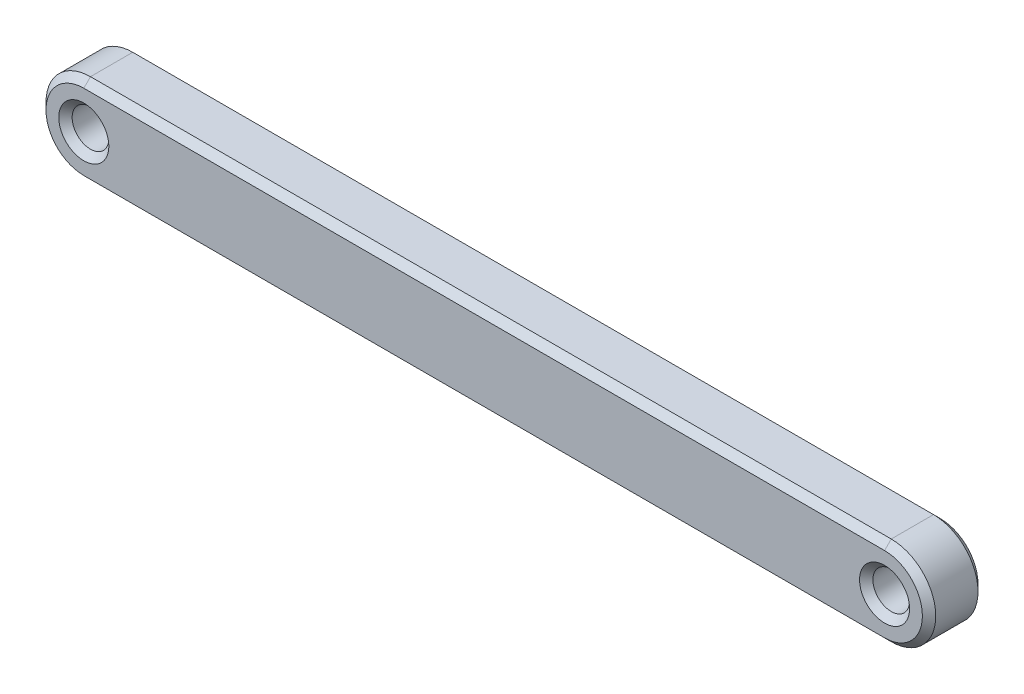
ISO-10303-21;
HEADER;
FILE_DESCRIPTION(('STEP AP214'),'2;1');
FILE_NAME('part.step','',(''),(''),'','','');
FILE_SCHEMA(('AUTOMOTIVE_DESIGN { 1 0 10303 214 1 1 1 1 }'));
ENDSEC;
DATA;
#1=APPLICATION_CONTEXT('core data for automotive mechanical design processes');
#2=APPLICATION_PROTOCOL_DEFINITION('international standard','automotive_design',2000,#1);
#3=PRODUCT_CONTEXT('',#1,'mechanical');
#4=PRODUCT('Part','Part','',(#3));
#5=PRODUCT_RELATED_PRODUCT_CATEGORY('part','',(#4));
#6=PRODUCT_DEFINITION_FORMATION('','',#4);
#7=PRODUCT_DEFINITION_CONTEXT('part definition',#1,'design');
#8=PRODUCT_DEFINITION('design','',#6,#7);
#9=PRODUCT_DEFINITION_SHAPE('','',#8);
#10=(LENGTH_UNIT() NAMED_UNIT(*) SI_UNIT(.MILLI.,.METRE.));
#11=(NAMED_UNIT(*) PLANE_ANGLE_UNIT() SI_UNIT($,.RADIAN.));
#12=(NAMED_UNIT(*) SI_UNIT($,.STERADIAN.) SOLID_ANGLE_UNIT());
#13=UNCERTAINTY_MEASURE_WITH_UNIT(LENGTH_MEASURE(1.E-05),#10,'distance_accuracy_value','');
#14=(GEOMETRIC_REPRESENTATION_CONTEXT(3) GLOBAL_UNCERTAINTY_ASSIGNED_CONTEXT((#13)) GLOBAL_UNIT_ASSIGNED_CONTEXT((#10,
#11,#12)) REPRESENTATION_CONTEXT('',''));
#15=CARTESIAN_POINT('',(0.,0.,0.));
#16=DIRECTION('',(0.,0.,1.));
#17=DIRECTION('',(1.,0.,0.));
#18=AXIS2_PLACEMENT_3D('',#15,#16,#17);
#19=CARTESIAN_POINT('',(-36.,0.,5.));
#20=DIRECTION('',(0.,0.,1.));
#21=DIRECTION('',(1.,0.,0.));
#22=AXIS2_PLACEMENT_3D('',#19,#20,#21);
#23=PLANE('',#22);
#24=CARTESIAN_POINT('',(36.,0.,5.));
#25=DIRECTION('',(0.,0.,1.));
#26=DIRECTION('',(1.,0.,0.));
#27=AXIS2_PLACEMENT_3D('',#24,#25,#26);
#28=CIRCLE('',#27,2.25);
#29=CARTESIAN_POINT('',(38.25,0.,5.));
#30=VERTEX_POINT('',#29);
#31=EDGE_CURVE('E171',#30,#30,#28,.F.);
#32=ORIENTED_EDGE('',*,*,#31,.T.);
#33=EDGE_LOOP('',(#32));
#34=FACE_BOUND('',#33,.T.);
#35=CARTESIAN_POINT('',(-36.,0.,5.));
#36=DIRECTION('',(0.,0.,1.));
#37=DIRECTION('',(1.,0.,0.));
#38=AXIS2_PLACEMENT_3D('',#35,#36,#37);
#39=CIRCLE('',#38,2.25);
#40=CARTESIAN_POINT('',(-33.75,0.,5.));
#41=VERTEX_POINT('',#40);
#42=EDGE_CURVE('E174',#41,#41,#39,.F.);
#43=ORIENTED_EDGE('',*,*,#42,.T.);
#44=EDGE_LOOP('',(#43));
#45=FACE_BOUND('',#44,.T.);
#46=CARTESIAN_POINT('',(-36.,0.,5.));
#47=DIRECTION('',(0.,0.,1.));
#48=DIRECTION('',(1.,0.,0.));
#49=AXIS2_PLACEMENT_3D('',#46,#47,#48);
#50=CIRCLE('',#49,3.40000000000002);
#51=CARTESIAN_POINT('',(-36.,3.40000000000002,5.));
#52=VERTEX_POINT('',#51);
#53=CARTESIAN_POINT('',(-36.,-3.40000000000002,5.));
#54=VERTEX_POINT('',#53);
#55=EDGE_CURVE('E182',#52,#54,#50,.T.);
#56=ORIENTED_EDGE('',*,*,#55,.T.);
#57=DIRECTION('',(1.,0.,0.));
#58=VECTOR('',#57,1.);
#59=CARTESIAN_POINT('',(36.,-3.4,5.));
#60=LINE('',#59,#58);
#61=CARTESIAN_POINT('',(36.,-3.4,5.));
#62=VERTEX_POINT('',#61);
#63=EDGE_CURVE('E177',#54,#62,#60,.T.);
#64=ORIENTED_EDGE('',*,*,#63,.T.);
#65=CARTESIAN_POINT('',(36.,0.,5.));
#66=DIRECTION('',(0.,0.,1.));
#67=DIRECTION('',(1.,0.,0.));
#68=AXIS2_PLACEMENT_3D('',#65,#66,#67);
#69=CIRCLE('',#68,3.40000000000002);
#70=CARTESIAN_POINT('',(36.,3.40000000000003,5.));
#71=VERTEX_POINT('',#70);
#72=EDGE_CURVE('E180',#62,#71,#69,.T.);
#73=ORIENTED_EDGE('',*,*,#72,.T.);
#74=DIRECTION('',(-1.,0.,0.));
#75=VECTOR('',#74,1.);
#76=CARTESIAN_POINT('',(-36.,3.40000000000002,5.));
#77=LINE('',#76,#75);
#78=EDGE_CURVE('E184',#71,#52,#77,.T.);
#79=ORIENTED_EDGE('',*,*,#78,.T.);
#80=EDGE_LOOP('',(#56,#64,#73,#79));
#81=FACE_BOUND('',#80,.T.);
#82=ADVANCED_FACE('F38',(#34,#45,#81),#23,.T.);
#83=CARTESIAN_POINT('',(-36.,0.,0.));
#84=DIRECTION('',(0.,0.,1.));
#85=DIRECTION('',(1.,0.,0.));
#86=AXIS2_PLACEMENT_3D('',#83,#84,#85);
#87=PLANE('',#86);
#88=CARTESIAN_POINT('',(36.,0.,0.));
#89=DIRECTION('',(0.,0.,1.));
#90=DIRECTION('',(1.,0.,0.));
#91=AXIS2_PLACEMENT_3D('',#88,#89,#90);
#92=CIRCLE('',#91,2.25);
#93=CARTESIAN_POINT('',(38.25,0.,0.));
#94=VERTEX_POINT('',#93);
#95=EDGE_CURVE('E198',#94,#94,#92,.T.);
#96=ORIENTED_EDGE('',*,*,#95,.T.);
#97=EDGE_LOOP('',(#96));
#98=FACE_BOUND('',#97,.T.);
#99=CARTESIAN_POINT('',(-36.,0.,0.));
#100=DIRECTION('',(0.,0.,1.));
#101=DIRECTION('',(1.,0.,0.));
#102=AXIS2_PLACEMENT_3D('',#99,#100,#101);
#103=CIRCLE('',#102,2.25000000000002);
#104=CARTESIAN_POINT('',(-33.75,0.,0.));
#105=VERTEX_POINT('',#104);
#106=EDGE_CURVE('E201',#105,#105,#103,.T.);
#107=ORIENTED_EDGE('',*,*,#106,.T.);
#108=EDGE_LOOP('',(#107));
#109=FACE_BOUND('',#108,.T.);
#110=CARTESIAN_POINT('',(36.,0.,0.));
#111=DIRECTION('',(0.,0.,1.));
#112=DIRECTION('',(1.,0.,0.));
#113=AXIS2_PLACEMENT_3D('',#110,#111,#112);
#114=CIRCLE('',#113,3.40000000000002);
#115=CARTESIAN_POINT('',(36.,3.40000000000003,0.));
#116=VERTEX_POINT('',#115);
#117=CARTESIAN_POINT('',(36.,-3.4,0.));
#118=VERTEX_POINT('',#117);
#119=EDGE_CURVE('E116',#116,#118,#114,.F.);
#120=ORIENTED_EDGE('',*,*,#119,.T.);
#121=DIRECTION('',(-1.,0.,0.));
#122=VECTOR('',#121,1.);
#123=CARTESIAN_POINT('',(-36.,-3.40000000000002,0.));
#124=LINE('',#123,#122);
#125=CARTESIAN_POINT('',(-36.,-3.40000000000002,0.));
#126=VERTEX_POINT('',#125);
#127=EDGE_CURVE('E112',#118,#126,#124,.T.);
#128=ORIENTED_EDGE('',*,*,#127,.T.);
#129=CARTESIAN_POINT('',(-36.,0.,0.));
#130=DIRECTION('',(0.,0.,1.));
#131=DIRECTION('',(1.,0.,0.));
#132=AXIS2_PLACEMENT_3D('',#129,#130,#131);
#133=CIRCLE('',#132,3.40000000000002);
#134=CARTESIAN_POINT('',(-36.,3.40000000000002,0.));
#135=VERTEX_POINT('',#134);
#136=EDGE_CURVE('E106',#126,#135,#133,.F.);
#137=ORIENTED_EDGE('',*,*,#136,.T.);
#138=DIRECTION('',(1.,0.,0.));
#139=VECTOR('',#138,1.);
#140=CARTESIAN_POINT('',(-36.,3.40000000000002,0.));
#141=LINE('',#140,#139);
#142=EDGE_CURVE('E109',#135,#116,#141,.T.);
#143=ORIENTED_EDGE('',*,*,#142,.T.);
#144=EDGE_LOOP('',(#120,#128,#137,#143));
#145=FACE_BOUND('',#144,.T.);
#146=ADVANCED_FACE('F108',(#98,#109,#145),#87,.F.);
#147=CARTESIAN_POINT('',(-36.,0.,5.));
#148=DIRECTION('',(0.,0.,-1.));
#149=DIRECTION('',(-1.,0.,0.));
#150=AXIS2_PLACEMENT_3D('',#147,#148,#149);
#151=CYLINDRICAL_SURFACE('',#150,4.00000000000001);
#152=DIRECTION('',(0.,0.,-1.));
#153=VECTOR('',#152,1.);
#154=CARTESIAN_POINT('',(-36.,4.00000000000001,5.));
#155=LINE('',#154,#153);
#156=CARTESIAN_POINT('',(-36.,4.00000000000001,4.4));
#157=VERTEX_POINT('',#156);
#158=CARTESIAN_POINT('',(-36.,4.00000000000001,0.599999999999996));
#159=VERTEX_POINT('',#158);
#160=EDGE_CURVE('E130',#157,#159,#155,.T.);
#161=ORIENTED_EDGE('',*,*,#160,.T.);
#162=CARTESIAN_POINT('',(-36.,0.,0.599999999999996));
#163=DIRECTION('',(0.,0.,1.));
#164=DIRECTION('',(1.,0.,0.));
#165=AXIS2_PLACEMENT_3D('',#162,#163,#164);
#166=CIRCLE('',#165,4.00000000000001);
#167=CARTESIAN_POINT('',(-36.,-4.00000000000001,0.599999999999996));
#168=VERTEX_POINT('',#167);
#169=EDGE_CURVE('E129',#159,#168,#166,.T.);
#170=ORIENTED_EDGE('',*,*,#169,.T.);
#171=DIRECTION('',(0.,0.,-1.));
#172=VECTOR('',#171,1.);
#173=CARTESIAN_POINT('',(-36.,-4.00000000000001,5.));
#174=LINE('',#173,#172);
#175=CARTESIAN_POINT('',(-36.,-4.00000000000001,4.4));
#176=VERTEX_POINT('',#175);
#177=EDGE_CURVE('E126',#176,#168,#174,.T.);
#178=ORIENTED_EDGE('',*,*,#177,.F.);
#179=CARTESIAN_POINT('',(-36.,0.,4.4));
#180=DIRECTION('',(0.,0.,1.));
#181=DIRECTION('',(1.,0.,0.));
#182=AXIS2_PLACEMENT_3D('',#179,#180,#181);
#183=CIRCLE('',#182,4.00000000000001);
#184=EDGE_CURVE('E61',#176,#157,#183,.F.);
#185=ORIENTED_EDGE('',*,*,#184,.T.);
#186=EDGE_LOOP('',(#161,#170,#178,#185));
#187=FACE_BOUND('',#186,.T.);
#188=ADVANCED_FACE('F229',(#187),#151,.T.);
#189=CARTESIAN_POINT('',(-36.,-4.00000000000001,5.));
#190=DIRECTION('',(0.,1.,0.));
#191=DIRECTION('',(-1.,0.,0.));
#192=AXIS2_PLACEMENT_3D('',#189,#190,#191);
#193=PLANE('',#192);
#194=ORIENTED_EDGE('',*,*,#177,.T.);
#195=DIRECTION('',(1.,0.,0.));
#196=VECTOR('',#195,1.);
#197=CARTESIAN_POINT('',(-36.,-4.00000000000001,0.599999999999996));
#198=LINE('',#197,#196);
#199=CARTESIAN_POINT('',(36.,-4.,0.599999999999996));
#200=VERTEX_POINT('',#199);
#201=EDGE_CURVE('E165',#168,#200,#198,.T.);
#202=ORIENTED_EDGE('',*,*,#201,.T.);
#203=DIRECTION('',(0.,0.,-1.));
#204=VECTOR('',#203,1.);
#205=CARTESIAN_POINT('',(36.,-4.,5.));
#206=LINE('',#205,#204);
#207=CARTESIAN_POINT('',(36.,-4.,4.4));
#208=VERTEX_POINT('',#207);
#209=EDGE_CURVE('E208',#208,#200,#206,.T.);
#210=ORIENTED_EDGE('',*,*,#209,.F.);
#211=DIRECTION('',(-1.,0.,0.));
#212=VECTOR('',#211,1.);
#213=CARTESIAN_POINT('',(-36.,-4.00000000000001,4.4));
#214=LINE('',#213,#212);
#215=EDGE_CURVE('E168',#208,#176,#214,.T.);
#216=ORIENTED_EDGE('',*,*,#215,.T.);
#217=EDGE_LOOP('',(#194,#202,#210,#216));
#218=FACE_BOUND('',#217,.T.);
#219=ADVANCED_FACE('F220',(#218),#193,.F.);
#220=CARTESIAN_POINT('',(36.,0.,5.));
#221=DIRECTION('',(0.,0.,-1.));
#222=DIRECTION('',(-1.,0.,0.));
#223=AXIS2_PLACEMENT_3D('',#220,#221,#222);
#224=CYLINDRICAL_SURFACE('',#223,4.00000000000001);
#225=ORIENTED_EDGE('',*,*,#209,.T.);
#226=CARTESIAN_POINT('',(36.,0.,0.599999999999996));
#227=DIRECTION('',(0.,0.,1.));
#228=DIRECTION('',(1.,0.,0.));
#229=AXIS2_PLACEMENT_3D('',#226,#227,#228);
#230=CIRCLE('',#229,4.00000000000001);
#231=CARTESIAN_POINT('',(36.,4.00000000000003,0.599999999999996));
#232=VERTEX_POINT('',#231);
#233=EDGE_CURVE('E161',#200,#232,#230,.T.);
#234=ORIENTED_EDGE('',*,*,#233,.T.);
#235=DIRECTION('',(0.,0.,-1.));
#236=VECTOR('',#235,1.);
#237=CARTESIAN_POINT('',(36.,4.00000000000003,5.));
#238=LINE('',#237,#236);
#239=CARTESIAN_POINT('',(36.,4.00000000000003,4.4));
#240=VERTEX_POINT('',#239);
#241=EDGE_CURVE('E132',#240,#232,#238,.T.);
#242=ORIENTED_EDGE('',*,*,#241,.F.);
#243=CARTESIAN_POINT('',(36.,0.,4.4));
#244=DIRECTION('',(0.,0.,1.));
#245=DIRECTION('',(1.,0.,0.));
#246=AXIS2_PLACEMENT_3D('',#243,#244,#245);
#247=CIRCLE('',#246,4.00000000000001);
#248=EDGE_CURVE('E163',#240,#208,#247,.F.);
#249=ORIENTED_EDGE('',*,*,#248,.T.);
#250=EDGE_LOOP('',(#225,#234,#242,#249));
#251=FACE_BOUND('',#250,.T.);
#252=ADVANCED_FACE('F222',(#251),#224,.T.);
#253=CARTESIAN_POINT('',(-36.,4.00000000000001,5.));
#254=DIRECTION('',(0.,-1.,0.));
#255=DIRECTION('',(1.,0.,0.));
#256=AXIS2_PLACEMENT_3D('',#253,#254,#255);
#257=PLANE('',#256);
#258=ORIENTED_EDGE('',*,*,#241,.T.);
#259=DIRECTION('',(-1.,0.,0.));
#260=VECTOR('',#259,1.);
#261=CARTESIAN_POINT('',(-36.,4.00000000000001,0.599999999999996));
#262=LINE('',#261,#260);
#263=EDGE_CURVE('E11',#232,#159,#262,.T.);
#264=ORIENTED_EDGE('',*,*,#263,.T.);
#265=ORIENTED_EDGE('',*,*,#160,.F.);
#266=DIRECTION('',(1.,0.,0.));
#267=VECTOR('',#266,1.);
#268=CARTESIAN_POINT('',(36.,4.00000000000003,4.4));
#269=LINE('',#268,#267);
#270=EDGE_CURVE('E48',#157,#240,#269,.T.);
#271=ORIENTED_EDGE('',*,*,#270,.T.);
#272=EDGE_LOOP('',(#258,#264,#265,#271));
#273=FACE_BOUND('',#272,.T.);
#274=ADVANCED_FACE('F212',(#273),#257,.F.);
#275=CARTESIAN_POINT('',(-36.,0.,5.));
#276=DIRECTION('',(0.,0.,-1.));
#277=DIRECTION('',(-1.,0.,0.));
#278=AXIS2_PLACEMENT_3D('',#275,#276,#277);
#279=CYLINDRICAL_SURFACE('',#278,1.65);
#280=CARTESIAN_POINT('',(-36.,0.,0.600000000000011));
#281=DIRECTION('',(0.,0.,1.));
#282=DIRECTION('',(1.,0.,0.));
#283=AXIS2_PLACEMENT_3D('',#280,#281,#282);
#284=CIRCLE('',#283,1.65);
#285=CARTESIAN_POINT('',(-34.35,0.,0.600000000000011));
#286=VERTEX_POINT('',#285);
#287=EDGE_CURVE('E186',#286,#286,#284,.F.);
#288=ORIENTED_EDGE('',*,*,#287,.T.);
#289=EDGE_LOOP('',(#288));
#290=FACE_BOUND('',#289,.T.);
#291=CARTESIAN_POINT('',(-36.,0.,4.40000000000001));
#292=DIRECTION('',(0.,0.,1.));
#293=DIRECTION('',(1.,0.,0.));
#294=AXIS2_PLACEMENT_3D('',#291,#292,#293);
#295=CIRCLE('',#294,1.65);
#296=CARTESIAN_POINT('',(-34.35,0.,4.40000000000001));
#297=VERTEX_POINT('',#296);
#298=EDGE_CURVE('E189',#297,#297,#295,.T.);
#299=ORIENTED_EDGE('',*,*,#298,.T.);
#300=EDGE_LOOP('',(#299));
#301=FACE_BOUND('',#300,.T.);
#302=ADVANCED_FACE('F251',(#290,#301),#279,.F.);
#303=CARTESIAN_POINT('',(36.,0.,5.));
#304=DIRECTION('',(0.,0.,-1.));
#305=DIRECTION('',(-1.,0.,0.));
#306=AXIS2_PLACEMENT_3D('',#303,#304,#305);
#307=CYLINDRICAL_SURFACE('',#306,1.65);
#308=CARTESIAN_POINT('',(36.,0.,0.59999999999999));
#309=DIRECTION('',(0.,0.,1.));
#310=DIRECTION('',(1.,0.,0.));
#311=AXIS2_PLACEMENT_3D('',#308,#309,#310);
#312=CIRCLE('',#311,1.65);
#313=CARTESIAN_POINT('',(37.65,0.,0.59999999999999));
#314=VERTEX_POINT('',#313);
#315=EDGE_CURVE('E192',#314,#314,#312,.F.);
#316=ORIENTED_EDGE('',*,*,#315,.T.);
#317=EDGE_LOOP('',(#316));
#318=FACE_BOUND('',#317,.T.);
#319=CARTESIAN_POINT('',(36.,0.,4.40000000000001));
#320=DIRECTION('',(0.,0.,1.));
#321=DIRECTION('',(1.,0.,0.));
#322=AXIS2_PLACEMENT_3D('',#319,#320,#321);
#323=CIRCLE('',#322,1.65);
#324=CARTESIAN_POINT('',(37.65,0.,4.40000000000001));
#325=VERTEX_POINT('',#324);
#326=EDGE_CURVE('E195',#325,#325,#323,.T.);
#327=ORIENTED_EDGE('',*,*,#326,.T.);
#328=EDGE_LOOP('',(#327));
#329=FACE_BOUND('',#328,.T.);
#330=ADVANCED_FACE('F270',(#318,#329),#307,.F.);
#331=CARTESIAN_POINT('',(36.,0.,0.));
#332=DIRECTION('',(0.,0.,-1.));
#333=DIRECTION('',(-1.,0.,0.));
#334=AXIS2_PLACEMENT_3D('',#331,#332,#333);
#335=CONICAL_SURFACE('',#334,2.25,0.78539816339745);
#336=ORIENTED_EDGE('',*,*,#315,.F.);
#337=EDGE_LOOP('',(#336));
#338=FACE_BOUND('',#337,.T.);
#339=ORIENTED_EDGE('',*,*,#95,.F.);
#340=EDGE_LOOP('',(#339));
#341=FACE_BOUND('',#340,.T.);
#342=ADVANCED_FACE('F263',(#338,#341),#335,.F.);
#343=CARTESIAN_POINT('',(-36.,0.,0.));
#344=DIRECTION('',(0.,0.,-1.));
#345=DIRECTION('',(-1.,0.,0.));
#346=AXIS2_PLACEMENT_3D('',#343,#344,#345);
#347=CONICAL_SURFACE('',#346,2.25000000000002,0.78539816339745);
#348=ORIENTED_EDGE('',*,*,#287,.F.);
#349=EDGE_LOOP('',(#348));
#350=FACE_BOUND('',#349,.T.);
#351=ORIENTED_EDGE('',*,*,#106,.F.);
#352=EDGE_LOOP('',(#351));
#353=FACE_BOUND('',#352,.T.);
#354=ADVANCED_FACE('F269',(#350,#353),#347,.F.);
#355=CARTESIAN_POINT('',(36.,0.,4.40000000000001));
#356=DIRECTION('',(0.,0.,1.));
#357=DIRECTION('',(1.,0.,0.));
#358=AXIS2_PLACEMENT_3D('',#355,#356,#357);
#359=CONICAL_SURFACE('',#358,1.65,0.785398163397451);
#360=ORIENTED_EDGE('',*,*,#31,.F.);
#361=EDGE_LOOP('',(#360));
#362=FACE_BOUND('',#361,.T.);
#363=ORIENTED_EDGE('',*,*,#326,.F.);
#364=EDGE_LOOP('',(#363));
#365=FACE_BOUND('',#364,.T.);
#366=ADVANCED_FACE('F277',(#362,#365),#359,.F.);
#367=CARTESIAN_POINT('',(-36.,0.,4.40000000000001));
#368=DIRECTION('',(0.,0.,1.));
#369=DIRECTION('',(1.,0.,0.));
#370=AXIS2_PLACEMENT_3D('',#367,#368,#369);
#371=CONICAL_SURFACE('',#370,1.65,0.785398163397451);
#372=ORIENTED_EDGE('',*,*,#42,.F.);
#373=EDGE_LOOP('',(#372));
#374=FACE_BOUND('',#373,.T.);
#375=ORIENTED_EDGE('',*,*,#298,.F.);
#376=EDGE_LOOP('',(#375));
#377=FACE_BOUND('',#376,.T.);
#378=ADVANCED_FACE('F284',(#374,#377),#371,.F.);
#379=CARTESIAN_POINT('',(-36.,4.00000000000001,0.599999999999996));
#380=DIRECTION('',(0.,-0.707106781186547,0.707106781186547));
#381=DIRECTION('',(-1.,0.,0.));
#382=AXIS2_PLACEMENT_3D('',#379,#380,#381);
#383=PLANE('',#382);
#384=DIRECTION('',(0.,0.707106781186547,0.707106781186547));
#385=VECTOR('',#384,1.);
#386=CARTESIAN_POINT('',(36.,3.40000000000003,0.));
#387=LINE('',#386,#385);
#388=EDGE_CURVE('E124',#116,#232,#387,.T.);
#389=ORIENTED_EDGE('',*,*,#388,.F.);
#390=ORIENTED_EDGE('',*,*,#142,.F.);
#391=DIRECTION('',(0.,-0.707106781186547,-0.707106781186547));
#392=VECTOR('',#391,1.);
#393=CARTESIAN_POINT('',(-36.,4.00000000000001,0.599999999999996));
#394=LINE('',#393,#392);
#395=EDGE_CURVE('E121',#159,#135,#394,.T.);
#396=ORIENTED_EDGE('',*,*,#395,.F.);
#397=ORIENTED_EDGE('',*,*,#263,.F.);
#398=EDGE_LOOP('',(#389,#390,#396,#397));
#399=FACE_BOUND('',#398,.T.);
#400=ADVANCED_FACE('F120',(#399),#383,.F.);
#401=CARTESIAN_POINT('',(-36.,0.,0.599999999999996));
#402=DIRECTION('',(0.,0.,1.));
#403=DIRECTION('',(1.,0.,0.));
#404=AXIS2_PLACEMENT_3D('',#401,#402,#403);
#405=CONICAL_SURFACE('',#404,4.00000000000001,0.785398163397448);
#406=ORIENTED_EDGE('',*,*,#395,.T.);
#407=ORIENTED_EDGE('',*,*,#136,.F.);
#408=DIRECTION('',(0.,0.707106781186547,-0.707106781186547));
#409=VECTOR('',#408,1.);
#410=CARTESIAN_POINT('',(-36.,-4.00000000000001,0.599999999999996));
#411=LINE('',#410,#409);
#412=EDGE_CURVE('E134',#168,#126,#411,.T.);
#413=ORIENTED_EDGE('',*,*,#412,.F.);
#414=ORIENTED_EDGE('',*,*,#169,.F.);
#415=EDGE_LOOP('',(#406,#407,#413,#414));
#416=FACE_BOUND('',#415,.T.);
#417=ADVANCED_FACE('F128',(#416),#405,.T.);
#418=CARTESIAN_POINT('',(36.,0.,0.599999999999996));
#419=DIRECTION('',(0.,0.,1.));
#420=DIRECTION('',(1.,0.,0.));
#421=AXIS2_PLACEMENT_3D('',#418,#419,#420);
#422=CONICAL_SURFACE('',#421,4.00000000000001,0.785398163397448);
#423=ORIENTED_EDGE('',*,*,#388,.T.);
#424=ORIENTED_EDGE('',*,*,#233,.F.);
#425=DIRECTION('',(0.,-0.707106781186547,0.707106781186547));
#426=VECTOR('',#425,1.);
#427=CARTESIAN_POINT('',(36.,-3.4,0.));
#428=LINE('',#427,#426);
#429=EDGE_CURVE('E148',#118,#200,#428,.T.);
#430=ORIENTED_EDGE('',*,*,#429,.F.);
#431=ORIENTED_EDGE('',*,*,#119,.F.);
#432=EDGE_LOOP('',(#423,#424,#430,#431));
#433=FACE_BOUND('',#432,.T.);
#434=ADVANCED_FACE('F216',(#433),#422,.T.);
#435=CARTESIAN_POINT('',(-36.,-4.00000000000001,0.599999999999996));
#436=DIRECTION('',(0.,0.707106781186547,0.707106781186547));
#437=DIRECTION('',(1.,0.,0.));
#438=AXIS2_PLACEMENT_3D('',#435,#436,#437);
#439=PLANE('',#438);
#440=ORIENTED_EDGE('',*,*,#412,.T.);
#441=ORIENTED_EDGE('',*,*,#127,.F.);
#442=ORIENTED_EDGE('',*,*,#429,.T.);
#443=ORIENTED_EDGE('',*,*,#201,.F.);
#444=EDGE_LOOP('',(#440,#441,#442,#443));
#445=FACE_BOUND('',#444,.T.);
#446=ADVANCED_FACE('F217',(#445),#439,.F.);
#447=CARTESIAN_POINT('',(-36.,3.40000000000002,5.));
#448=DIRECTION('',(0.,0.707106781186547,0.707106781186547));
#449=DIRECTION('',(1.,0.,0.));
#450=AXIS2_PLACEMENT_3D('',#447,#448,#449);
#451=PLANE('',#450);
#452=DIRECTION('',(0.,-0.707106781186547,0.707106781186547));
#453=VECTOR('',#452,1.);
#454=CARTESIAN_POINT('',(36.,4.00000000000003,4.4));
#455=LINE('',#454,#453);
#456=EDGE_CURVE('E141',#240,#71,#455,.T.);
#457=ORIENTED_EDGE('',*,*,#456,.F.);
#458=ORIENTED_EDGE('',*,*,#270,.F.);
#459=DIRECTION('',(0.,0.707106781186547,-0.707106781186547));
#460=VECTOR('',#459,1.);
#461=CARTESIAN_POINT('',(-36.,3.40000000000002,5.));
#462=LINE('',#461,#460);
#463=EDGE_CURVE('E43',#52,#157,#462,.T.);
#464=ORIENTED_EDGE('',*,*,#463,.F.);
#465=ORIENTED_EDGE('',*,*,#78,.F.);
#466=EDGE_LOOP('',(#457,#458,#464,#465));
#467=FACE_BOUND('',#466,.T.);
#468=ADVANCED_FACE('F41',(#467),#451,.T.);
#469=CARTESIAN_POINT('',(-36.,0.,5.));
#470=DIRECTION('',(0.,0.,-1.));
#471=DIRECTION('',(-1.,0.,0.));
#472=AXIS2_PLACEMENT_3D('',#469,#470,#471);
#473=CONICAL_SURFACE('',#472,3.40000000000002,0.785398163397448);
#474=ORIENTED_EDGE('',*,*,#463,.T.);
#475=ORIENTED_EDGE('',*,*,#184,.F.);
#476=DIRECTION('',(0.,-0.707106781186547,-0.707106781186547));
#477=VECTOR('',#476,1.);
#478=CARTESIAN_POINT('',(-36.,-3.40000000000002,5.));
#479=LINE('',#478,#477);
#480=EDGE_CURVE('E140',#54,#176,#479,.T.);
#481=ORIENTED_EDGE('',*,*,#480,.F.);
#482=ORIENTED_EDGE('',*,*,#55,.F.);
#483=EDGE_LOOP('',(#474,#475,#481,#482));
#484=FACE_BOUND('',#483,.T.);
#485=ADVANCED_FACE('F233',(#484),#473,.T.);
#486=CARTESIAN_POINT('',(36.,0.,5.));
#487=DIRECTION('',(0.,0.,-1.));
#488=DIRECTION('',(-1.,0.,0.));
#489=AXIS2_PLACEMENT_3D('',#486,#487,#488);
#490=CONICAL_SURFACE('',#489,3.40000000000002,0.785398163397448);
#491=ORIENTED_EDGE('',*,*,#456,.T.);
#492=ORIENTED_EDGE('',*,*,#72,.F.);
#493=DIRECTION('',(0.,0.707106781186547,0.707106781186547));
#494=VECTOR('',#493,1.);
#495=CARTESIAN_POINT('',(36.,-4.,4.4));
#496=LINE('',#495,#494);
#497=EDGE_CURVE('E138',#208,#62,#496,.T.);
#498=ORIENTED_EDGE('',*,*,#497,.F.);
#499=ORIENTED_EDGE('',*,*,#248,.F.);
#500=EDGE_LOOP('',(#491,#492,#498,#499));
#501=FACE_BOUND('',#500,.T.);
#502=ADVANCED_FACE('F224',(#501),#490,.T.);
#503=CARTESIAN_POINT('',(-36.,-3.40000000000002,5.));
#504=DIRECTION('',(0.,-0.707106781186547,0.707106781186547));
#505=DIRECTION('',(-1.,0.,0.));
#506=AXIS2_PLACEMENT_3D('',#503,#504,#505);
#507=PLANE('',#506);
#508=ORIENTED_EDGE('',*,*,#480,.T.);
#509=ORIENTED_EDGE('',*,*,#215,.F.);
#510=ORIENTED_EDGE('',*,*,#497,.T.);
#511=ORIENTED_EDGE('',*,*,#63,.F.);
#512=EDGE_LOOP('',(#508,#509,#510,#511));
#513=FACE_BOUND('',#512,.T.);
#514=ADVANCED_FACE('F227',(#513),#507,.T.);
#515=CLOSED_SHELL('',(#82,#146,#188,#219,#252,#274,#302,#330,#342,#354,#366,#378,#400,#417,#434,
#446,#468,#485,#502,#514));
#516=MANIFOLD_SOLID_BREP('B2',#515);
#517=ADVANCED_BREP_SHAPE_REPRESENTATION('',(#18,#516),#14);
#518=SHAPE_DEFINITION_REPRESENTATION(#9,#517);
ENDSEC;
END-ISO-10303-21;
